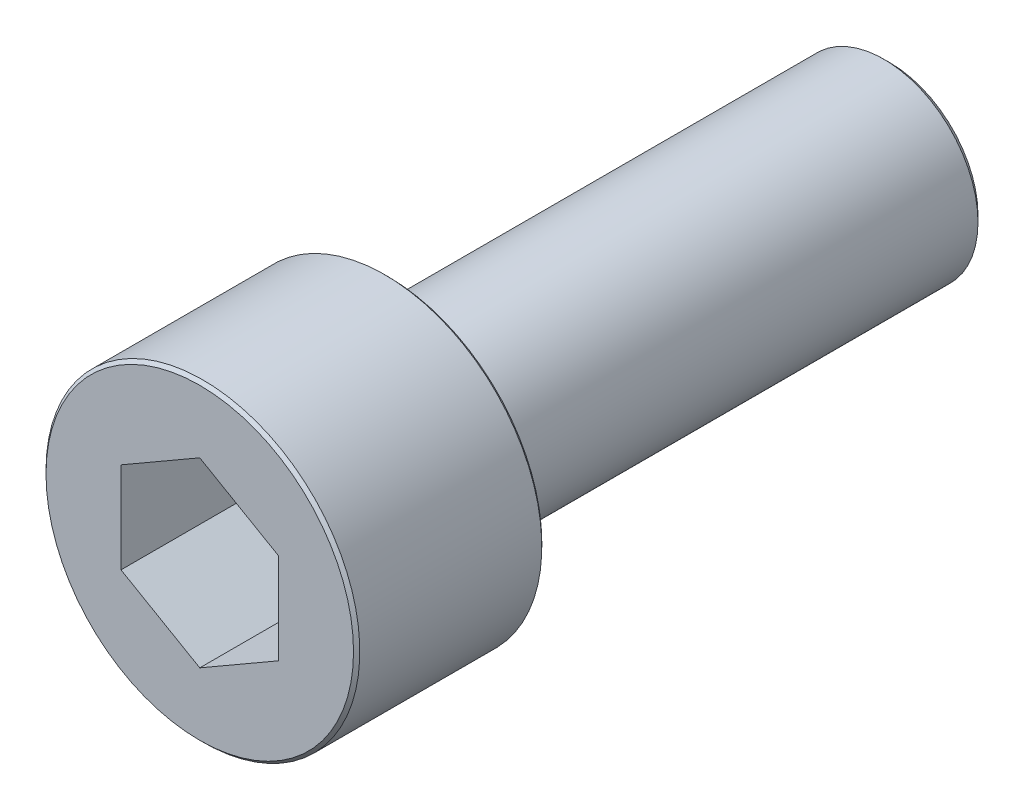
ISO-10303-21;
HEADER;
FILE_DESCRIPTION(('STEP AP214'),'2;1');
FILE_NAME('part.step','',(''),(''),'','','');
FILE_SCHEMA(('AUTOMOTIVE_DESIGN { 1 0 10303 214 1 1 1 1 }'));
ENDSEC;
DATA;
#1=APPLICATION_CONTEXT('core data for automotive mechanical design processes');
#2=APPLICATION_PROTOCOL_DEFINITION('international standard','automotive_design',2000,#1);
#3=PRODUCT_CONTEXT('',#1,'mechanical');
#4=PRODUCT('Part','Part','',(#3));
#5=PRODUCT_RELATED_PRODUCT_CATEGORY('part','',(#4));
#6=PRODUCT_DEFINITION_FORMATION('','',#4);
#7=PRODUCT_DEFINITION_CONTEXT('part definition',#1,'design');
#8=PRODUCT_DEFINITION('design','',#6,#7);
#9=PRODUCT_DEFINITION_SHAPE('','',#8);
#10=(LENGTH_UNIT() NAMED_UNIT(*) SI_UNIT(.MILLI.,.METRE.));
#11=(NAMED_UNIT(*) PLANE_ANGLE_UNIT() SI_UNIT($,.RADIAN.));
#12=(NAMED_UNIT(*) SI_UNIT($,.STERADIAN.) SOLID_ANGLE_UNIT());
#13=UNCERTAINTY_MEASURE_WITH_UNIT(LENGTH_MEASURE(1.E-05),#10,'distance_accuracy_value','');
#14=(GEOMETRIC_REPRESENTATION_CONTEXT(3) GLOBAL_UNCERTAINTY_ASSIGNED_CONTEXT((#13)) GLOBAL_UNIT_ASSIGNED_CONTEXT((#10,
#11,#12)) REPRESENTATION_CONTEXT('',''));
#15=CARTESIAN_POINT('',(0.,0.,0.));
#16=DIRECTION('',(0.,0.,1.));
#17=DIRECTION('',(1.,0.,0.));
#18=AXIS2_PLACEMENT_3D('',#15,#16,#17);
#19=CARTESIAN_POINT('',(0.,0.,16.));
#20=DIRECTION('',(0.,0.,1.));
#21=DIRECTION('',(1.,0.,0.));
#22=AXIS2_PLACEMENT_3D('',#19,#20,#21);
#23=CYLINDRICAL_SURFACE('',#22,5.);
#24=CARTESIAN_POINT('',(0.,0.,16.0999996677392));
#25=DIRECTION('',(0.,0.,-1.));
#26=DIRECTION('',(-1.,0.,0.));
#27=AXIS2_PLACEMENT_3D('',#24,#25,#26);
#28=CIRCLE('',#27,5.);
#29=CARTESIAN_POINT('',(-5.,0.,16.0999996677392));
#30=VERTEX_POINT('',#29);
#31=EDGE_CURVE('E155',#30,#30,#28,.F.);
#32=ORIENTED_EDGE('',*,*,#31,.T.);
#33=EDGE_LOOP('',(#32));
#34=FACE_BOUND('',#33,.T.);
#35=CARTESIAN_POINT('',(0.,0.,21.9000003750631));
#36=DIRECTION('',(0.,0.,1.));
#37=DIRECTION('',(1.,0.,0.));
#38=AXIS2_PLACEMENT_3D('',#35,#36,#37);
#39=CIRCLE('',#38,5.);
#40=CARTESIAN_POINT('',(-5.,0.,21.9000003750631));
#41=VERTEX_POINT('',#40);
#42=EDGE_CURVE('E152',#41,#41,#39,.F.);
#43=ORIENTED_EDGE('',*,*,#42,.T.);
#44=EDGE_LOOP('',(#43));
#45=FACE_BOUND('',#44,.T.);
#46=ADVANCED_FACE('F41',(#34,#45),#23,.T.);
#47=CARTESIAN_POINT('',(5.,0.,16.));
#48=DIRECTION('',(0.,0.,-1.));
#49=DIRECTION('',(-1.,0.,0.));
#50=AXIS2_PLACEMENT_3D('',#47,#48,#49);
#51=PLANE('',#50);
#52=CARTESIAN_POINT('',(0.,0.,16.));
#53=DIRECTION('',(0.,0.,-1.));
#54=DIRECTION('',(-1.,0.,0.));
#55=AXIS2_PLACEMENT_3D('',#52,#53,#54);
#56=CIRCLE('',#55,4.90000037506315);
#57=CARTESIAN_POINT('',(-4.90000037506315,0.,16.));
#58=VERTEX_POINT('',#57);
#59=EDGE_CURVE('E158',#58,#58,#56,.T.);
#60=ORIENTED_EDGE('',*,*,#59,.T.);
#61=EDGE_LOOP('',(#60));
#62=FACE_BOUND('',#61,.T.);
#63=CARTESIAN_POINT('',(0.,0.,16.));
#64=DIRECTION('',(0.,0.,-1.));
#65=DIRECTION('',(-1.,0.,0.));
#66=AXIS2_PLACEMENT_3D('',#63,#64,#65);
#67=CIRCLE('',#66,3.);
#68=CARTESIAN_POINT('',(-3.,0.,16.));
#69=VERTEX_POINT('',#68);
#70=EDGE_CURVE('E144',#69,#69,#67,.T.);
#71=ORIENTED_EDGE('',*,*,#70,.F.);
#72=EDGE_LOOP('',(#71));
#73=FACE_BOUND('',#72,.T.);
#74=ADVANCED_FACE('F178',(#62,#73),#51,.T.);
#75=CARTESIAN_POINT('',(0.,0.,22.));
#76=DIRECTION('',(0.,0.,1.));
#77=DIRECTION('',(1.,0.,0.));
#78=AXIS2_PLACEMENT_3D('',#75,#76,#77);
#79=PLANE('',#78);
#80=CARTESIAN_POINT('',(0.,0.,22.));
#81=DIRECTION('',(0.,0.,1.));
#82=DIRECTION('',(1.,0.,0.));
#83=AXIS2_PLACEMENT_3D('',#80,#81,#82);
#84=CIRCLE('',#83,4.90000033226079);
#85=CARTESIAN_POINT('',(-4.90000033226079,0.,22.));
#86=VERTEX_POINT('',#85);
#87=EDGE_CURVE('E161',#86,#86,#84,.T.);
#88=ORIENTED_EDGE('',*,*,#87,.T.);
#89=EDGE_LOOP('',(#88));
#90=FACE_BOUND('',#89,.T.);
#91=DIRECTION('',(0.,-1.,0.));
#92=VECTOR('',#91,1.);
#93=CARTESIAN_POINT('',(-2.51,1.449149175666,22.));
#94=LINE('',#93,#92);
#95=CARTESIAN_POINT('',(-2.51,1.449149175666,22.));
#96=VERTEX_POINT('',#95);
#97=CARTESIAN_POINT('',(-2.51,-1.449149175666,22.));
#98=VERTEX_POINT('',#97);
#99=EDGE_CURVE('E57',#96,#98,#94,.T.);
#100=ORIENTED_EDGE('',*,*,#99,.F.);
#101=DIRECTION('',(-0.866025403784431,-0.500000000000014,0.));
#102=VECTOR('',#101,1.);
#103=CARTESIAN_POINT('',(0.,2.89829835133201,22.));
#104=LINE('',#103,#102);
#105=CARTESIAN_POINT('',(0.,2.89829835133201,22.));
#106=VERTEX_POINT('',#105);
#107=EDGE_CURVE('E140',#106,#96,#104,.T.);
#108=ORIENTED_EDGE('',*,*,#107,.F.);
#109=DIRECTION('',(-0.866025403784431,0.500000000000014,0.));
#110=VECTOR('',#109,1.);
#111=CARTESIAN_POINT('',(2.51,1.449149175666,22.));
#112=LINE('',#111,#110);
#113=CARTESIAN_POINT('',(2.51,1.449149175666,22.));
#114=VERTEX_POINT('',#113);
#115=EDGE_CURVE('E138',#114,#106,#112,.T.);
#116=ORIENTED_EDGE('',*,*,#115,.F.);
#117=DIRECTION('',(0.,1.,0.));
#118=VECTOR('',#117,1.);
#119=CARTESIAN_POINT('',(2.51,-1.449149175666,22.));
#120=LINE('',#119,#118);
#121=CARTESIAN_POINT('',(2.51,-1.449149175666,22.));
#122=VERTEX_POINT('',#121);
#123=EDGE_CURVE('E105',#122,#114,#120,.T.);
#124=ORIENTED_EDGE('',*,*,#123,.F.);
#125=DIRECTION('',(0.866025403784431,0.500000000000013,0.));
#126=VECTOR('',#125,1.);
#127=CARTESIAN_POINT('',(0.,-2.898298351332,22.));
#128=LINE('',#127,#126);
#129=CARTESIAN_POINT('',(0.,-2.898298351332,22.));
#130=VERTEX_POINT('',#129);
#131=EDGE_CURVE('E134',#130,#122,#128,.T.);
#132=ORIENTED_EDGE('',*,*,#131,.F.);
#133=DIRECTION('',(0.866025403784432,-0.500000000000012,0.));
#134=VECTOR('',#133,1.);
#135=CARTESIAN_POINT('',(-2.51,-1.449149175666,22.));
#136=LINE('',#135,#134);
#137=EDGE_CURVE('E131',#98,#130,#136,.T.);
#138=ORIENTED_EDGE('',*,*,#137,.F.);
#139=EDGE_LOOP('',(#100,#108,#116,#124,#132,#138));
#140=FACE_BOUND('',#139,.T.);
#141=ADVANCED_FACE('F184',(#90,#140),#79,.T.);
#142=CARTESIAN_POINT('',(0.,0.,0.));
#143=DIRECTION('',(0.,0.,1.));
#144=DIRECTION('',(1.,0.,0.));
#145=AXIS2_PLACEMENT_3D('',#142,#143,#144);
#146=CYLINDRICAL_SURFACE('',#145,3.);
#147=CARTESIAN_POINT('',(0.,0.,0.200009615210983));
#148=DIRECTION('',(0.,0.,-1.));
#149=DIRECTION('',(-1.,0.,0.));
#150=AXIS2_PLACEMENT_3D('',#147,#148,#149);
#151=CIRCLE('',#150,3.);
#152=CARTESIAN_POINT('',(-3.,0.,0.200009615210983));
#153=VERTEX_POINT('',#152);
#154=EDGE_CURVE('E11',#153,#153,#151,.F.);
#155=ORIENTED_EDGE('',*,*,#154,.T.);
#156=EDGE_LOOP('',(#155));
#157=FACE_BOUND('',#156,.T.);
#158=ORIENTED_EDGE('',*,*,#70,.T.);
#159=EDGE_LOOP('',(#158));
#160=FACE_BOUND('',#159,.T.);
#161=ADVANCED_FACE('F211',(#157,#160),#146,.T.);
#162=CARTESIAN_POINT('',(0.,0.,0.));
#163=DIRECTION('',(0.,0.,-1.));
#164=DIRECTION('',(-1.,0.,0.));
#165=AXIS2_PLACEMENT_3D('',#162,#163,#164);
#166=PLANE('',#165);
#167=CARTESIAN_POINT('',(0.,0.,0.));
#168=DIRECTION('',(0.,0.,-1.));
#169=DIRECTION('',(-1.,0.,0.));
#170=AXIS2_PLACEMENT_3D('',#167,#168,#169);
#171=CIRCLE('',#170,2.79999102583599);
#172=CARTESIAN_POINT('',(-2.79999102583599,0.,0.));
#173=VERTEX_POINT('',#172);
#174=EDGE_CURVE('E50',#173,#173,#171,.T.);
#175=ORIENTED_EDGE('',*,*,#174,.T.);
#176=EDGE_LOOP('',(#175));
#177=FACE_BOUND('',#176,.T.);
#178=ADVANCED_FACE('F166',(#177),#166,.T.);
#179=CARTESIAN_POINT('',(-2.51,1.449149175666,17.5));
#180=DIRECTION('',(-1.,0.,0.));
#181=DIRECTION('',(0.,-1.,0.));
#182=AXIS2_PLACEMENT_3D('',#179,#180,#181);
#183=PLANE('',#182);
#184=ORIENTED_EDGE('',*,*,#99,.T.);
#185=DIRECTION('',(0.,0.,1.));
#186=VECTOR('',#185,1.);
#187=CARTESIAN_POINT('',(-2.51,-1.449149175666,17.5));
#188=LINE('',#187,#186);
#189=CARTESIAN_POINT('',(-2.51,-1.449149175666,17.5));
#190=VERTEX_POINT('',#189);
#191=EDGE_CURVE('E87',#190,#98,#188,.T.);
#192=ORIENTED_EDGE('',*,*,#191,.F.);
#193=DIRECTION('',(0.,-1.,0.));
#194=VECTOR('',#193,1.);
#195=CARTESIAN_POINT('',(-2.51,1.449149175666,17.5));
#196=LINE('',#195,#194);
#197=CARTESIAN_POINT('',(-2.51,1.449149175666,17.5));
#198=VERTEX_POINT('',#197);
#199=EDGE_CURVE('E142',#198,#190,#196,.T.);
#200=ORIENTED_EDGE('',*,*,#199,.F.);
#201=DIRECTION('',(0.,0.,1.));
#202=VECTOR('',#201,1.);
#203=CARTESIAN_POINT('',(-2.51,1.449149175666,17.5));
#204=LINE('',#203,#202);
#205=EDGE_CURVE('E65',#198,#96,#204,.T.);
#206=ORIENTED_EDGE('',*,*,#205,.T.);
#207=EDGE_LOOP('',(#184,#192,#200,#206));
#208=FACE_BOUND('',#207,.T.);
#209=ADVANCED_FACE('F219',(#208),#183,.F.);
#210=CARTESIAN_POINT('',(0.,2.89829835133201,17.5));
#211=DIRECTION('',(-0.500000000000014,0.866025403784431,0.));
#212=DIRECTION('',(-0.866025403784431,-0.500000000000014,0.));
#213=AXIS2_PLACEMENT_3D('',#210,#211,#212);
#214=PLANE('',#213);
#215=ORIENTED_EDGE('',*,*,#107,.T.);
#216=ORIENTED_EDGE('',*,*,#205,.F.);
#217=DIRECTION('',(-0.866025403784431,-0.500000000000014,0.));
#218=VECTOR('',#217,1.);
#219=CARTESIAN_POINT('',(0.,2.89829835133201,17.5));
#220=LINE('',#219,#218);
#221=CARTESIAN_POINT('',(0.,2.89829835133201,17.5));
#222=VERTEX_POINT('',#221);
#223=EDGE_CURVE('E117',#222,#198,#220,.T.);
#224=ORIENTED_EDGE('',*,*,#223,.F.);
#225=DIRECTION('',(0.,0.,1.));
#226=VECTOR('',#225,1.);
#227=CARTESIAN_POINT('',(0.,2.89829835133201,17.5));
#228=LINE('',#227,#226);
#229=EDGE_CURVE('E109',#222,#106,#228,.T.);
#230=ORIENTED_EDGE('',*,*,#229,.T.);
#231=EDGE_LOOP('',(#215,#216,#224,#230));
#232=FACE_BOUND('',#231,.T.);
#233=ADVANCED_FACE('F225',(#232),#214,.F.);
#234=CARTESIAN_POINT('',(2.51,1.449149175666,17.5));
#235=DIRECTION('',(0.500000000000014,0.866025403784431,0.));
#236=DIRECTION('',(-0.866025403784431,0.500000000000014,0.));
#237=AXIS2_PLACEMENT_3D('',#234,#235,#236);
#238=PLANE('',#237);
#239=ORIENTED_EDGE('',*,*,#115,.T.);
#240=ORIENTED_EDGE('',*,*,#229,.F.);
#241=DIRECTION('',(-0.866025403784431,0.500000000000014,0.));
#242=VECTOR('',#241,1.);
#243=CARTESIAN_POINT('',(2.51,1.449149175666,17.5));
#244=LINE('',#243,#242);
#245=CARTESIAN_POINT('',(2.51,1.449149175666,17.5));
#246=VERTEX_POINT('',#245);
#247=EDGE_CURVE('E113',#246,#222,#244,.T.);
#248=ORIENTED_EDGE('',*,*,#247,.F.);
#249=DIRECTION('',(0.,0.,1.));
#250=VECTOR('',#249,1.);
#251=CARTESIAN_POINT('',(2.51,1.449149175666,17.5));
#252=LINE('',#251,#250);
#253=EDGE_CURVE('E98',#246,#114,#252,.T.);
#254=ORIENTED_EDGE('',*,*,#253,.T.);
#255=EDGE_LOOP('',(#239,#240,#248,#254));
#256=FACE_BOUND('',#255,.T.);
#257=ADVANCED_FACE('F114',(#256),#238,.F.);
#258=CARTESIAN_POINT('',(2.51,-1.449149175666,17.5));
#259=DIRECTION('',(1.,0.,0.));
#260=DIRECTION('',(0.,1.,0.));
#261=AXIS2_PLACEMENT_3D('',#258,#259,#260);
#262=PLANE('',#261);
#263=ORIENTED_EDGE('',*,*,#123,.T.);
#264=ORIENTED_EDGE('',*,*,#253,.F.);
#265=DIRECTION('',(0.,1.,0.));
#266=VECTOR('',#265,1.);
#267=CARTESIAN_POINT('',(2.51,-1.449149175666,17.5));
#268=LINE('',#267,#266);
#269=CARTESIAN_POINT('',(2.51,-1.449149175666,17.5));
#270=VERTEX_POINT('',#269);
#271=EDGE_CURVE('E102',#270,#246,#268,.T.);
#272=ORIENTED_EDGE('',*,*,#271,.F.);
#273=DIRECTION('',(0.,0.,1.));
#274=VECTOR('',#273,1.);
#275=CARTESIAN_POINT('',(2.51,-1.449149175666,17.5));
#276=LINE('',#275,#274);
#277=EDGE_CURVE('E110',#270,#122,#276,.T.);
#278=ORIENTED_EDGE('',*,*,#277,.T.);
#279=EDGE_LOOP('',(#263,#264,#272,#278));
#280=FACE_BOUND('',#279,.T.);
#281=ADVANCED_FACE('F100',(#280),#262,.F.);
#282=CARTESIAN_POINT('',(0.,-2.898298351332,17.5));
#283=DIRECTION('',(0.500000000000013,-0.866025403784431,0.));
#284=DIRECTION('',(0.866025403784431,0.500000000000013,0.));
#285=AXIS2_PLACEMENT_3D('',#282,#283,#284);
#286=PLANE('',#285);
#287=ORIENTED_EDGE('',*,*,#131,.T.);
#288=ORIENTED_EDGE('',*,*,#277,.F.);
#289=DIRECTION('',(0.866025403784431,0.500000000000013,0.));
#290=VECTOR('',#289,1.);
#291=CARTESIAN_POINT('',(0.,-2.898298351332,17.5));
#292=LINE('',#291,#290);
#293=CARTESIAN_POINT('',(0.,-2.898298351332,17.5));
#294=VERTEX_POINT('',#293);
#295=EDGE_CURVE('E123',#294,#270,#292,.T.);
#296=ORIENTED_EDGE('',*,*,#295,.F.);
#297=DIRECTION('',(0.,0.,1.));
#298=VECTOR('',#297,1.);
#299=CARTESIAN_POINT('',(0.,-2.898298351332,17.5));
#300=LINE('',#299,#298);
#301=EDGE_CURVE('E147',#294,#130,#300,.T.);
#302=ORIENTED_EDGE('',*,*,#301,.T.);
#303=EDGE_LOOP('',(#287,#288,#296,#302));
#304=FACE_BOUND('',#303,.T.);
#305=ADVANCED_FACE('F228',(#304),#286,.F.);
#306=CARTESIAN_POINT('',(-2.51,-1.449149175666,17.5));
#307=DIRECTION('',(-0.500000000000012,-0.866025403784432,0.));
#308=DIRECTION('',(0.866025403784432,-0.500000000000012,0.));
#309=AXIS2_PLACEMENT_3D('',#306,#307,#308);
#310=PLANE('',#309);
#311=ORIENTED_EDGE('',*,*,#137,.T.);
#312=ORIENTED_EDGE('',*,*,#301,.F.);
#313=DIRECTION('',(0.866025403784432,-0.500000000000012,0.));
#314=VECTOR('',#313,1.);
#315=CARTESIAN_POINT('',(-2.51,-1.449149175666,17.5));
#316=LINE('',#315,#314);
#317=EDGE_CURVE('E125',#190,#294,#316,.T.);
#318=ORIENTED_EDGE('',*,*,#317,.F.);
#319=ORIENTED_EDGE('',*,*,#191,.T.);
#320=EDGE_LOOP('',(#311,#312,#318,#319));
#321=FACE_BOUND('',#320,.T.);
#322=ADVANCED_FACE('F203',(#321),#310,.F.);
#323=CARTESIAN_POINT('',(0.,0.,17.5));
#324=DIRECTION('',(0.,0.,1.));
#325=DIRECTION('',(1.,0.,0.));
#326=AXIS2_PLACEMENT_3D('',#323,#324,#325);
#327=PLANE('',#326);
#328=ORIENTED_EDGE('',*,*,#199,.T.);
#329=ORIENTED_EDGE('',*,*,#317,.T.);
#330=ORIENTED_EDGE('',*,*,#295,.T.);
#331=ORIENTED_EDGE('',*,*,#271,.T.);
#332=ORIENTED_EDGE('',*,*,#247,.T.);
#333=ORIENTED_EDGE('',*,*,#223,.T.);
#334=EDGE_LOOP('',(#328,#329,#330,#331,#332,#333));
#335=FACE_BOUND('',#334,.T.);
#336=ADVANCED_FACE('F120',(#335),#327,.T.);
#337=CARTESIAN_POINT('',(0.,0.,16.0999996677392));
#338=DIRECTION('',(0.,0.,1.));
#339=DIRECTION('',(1.,0.,0.));
#340=AXIS2_PLACEMENT_3D('',#337,#338,#339);
#341=CONICAL_SURFACE('',#340,5.,0.78539794938491);
#342=ORIENTED_EDGE('',*,*,#59,.F.);
#343=EDGE_LOOP('',(#342));
#344=FACE_BOUND('',#343,.T.);
#345=ORIENTED_EDGE('',*,*,#31,.F.);
#346=EDGE_LOOP('',(#345));
#347=FACE_BOUND('',#346,.T.);
#348=ADVANCED_FACE('F174',(#344,#347),#341,.T.);
#349=CARTESIAN_POINT('',(0.,0.,22.));
#350=DIRECTION('',(0.,0.,-1.));
#351=DIRECTION('',(-1.,0.,0.));
#352=AXIS2_PLACEMENT_3D('',#349,#350,#351);
#353=CONICAL_SURFACE('',#352,4.90000033226079,0.785398377409995);
#354=CARTESIAN_POINT('',(-5.,0.,21.9000003750631));
#355=CARTESIAN_POINT('',(-4.99895833679438,0.,21.9010420378229));
#356=CARTESIAN_POINT('',(-4.99791667358877,0.,21.9020837005827));
#357=CARTESIAN_POINT('',(-4.99583334717753,0.,21.9041670261022));
#358=CARTESIAN_POINT('',(-4.99479168397192,0.,21.9052086888619));
#359=CARTESIAN_POINT('',(-4.99270835756068,0.,21.9072920143815));
#360=CARTESIAN_POINT('',(-4.99166669435507,0.,21.9083336771412));
#361=CARTESIAN_POINT('',(-4.98958336794383,0.,21.9104170026607));
#362=CARTESIAN_POINT('',(-4.98854170473822,0.,21.9114586654205));
#363=CARTESIAN_POINT('',(-4.98645837832698,0.,21.91354199094));
#364=CARTESIAN_POINT('',(-4.98541671512137,0.,21.9145836536998));
#365=CARTESIAN_POINT('',(-4.98333338871013,0.,21.9166669792193));
#366=CARTESIAN_POINT('',(-4.98229172550452,0.,21.917708641979));
#367=CARTESIAN_POINT('',(-4.98020839909328,0.,21.9197919674986));
#368=CARTESIAN_POINT('',(-4.97916673588767,0.,21.9208336302583));
#369=CARTESIAN_POINT('',(-4.97708340947643,0.,21.9229169557778));
#370=CARTESIAN_POINT('',(-4.97604174627081,0.,21.9239586185376));
#371=CARTESIAN_POINT('',(-4.97395841985958,0.,21.9260419440571));
#372=CARTESIAN_POINT('',(-4.97291675665396,0.,21.9270836068169));
#373=CARTESIAN_POINT('',(-4.97083343024273,0.,21.9291669323364));
#374=CARTESIAN_POINT('',(-4.96979176703711,0.,21.9302085950962));
#375=CARTESIAN_POINT('',(-4.96770844062588,0.,21.9322919206157));
#376=CARTESIAN_POINT('',(-4.96666677742026,0.,21.9333335833754));
#377=CARTESIAN_POINT('',(-4.96458345100903,0.,21.9354169088949));
#378=CARTESIAN_POINT('',(-4.96354178780341,0.,21.9364585716547));
#379=CARTESIAN_POINT('',(-4.96145846139218,0.,21.9385418971742));
#380=CARTESIAN_POINT('',(-4.96041679818656,0.,21.939583559934));
#381=CARTESIAN_POINT('',(-4.95833347177533,0.,21.9416668854535));
#382=CARTESIAN_POINT('',(-4.95729180856971,0.,21.9427085482133));
#383=CARTESIAN_POINT('',(-4.95520848215848,0.,21.9447918737328));
#384=CARTESIAN_POINT('',(-4.95416681895286,0.,21.9458335364925));
#385=CARTESIAN_POINT('',(-4.95208349254163,0.,21.9479168620121));
#386=CARTESIAN_POINT('',(-4.95104182933601,0.,21.9489585247718));
#387=CARTESIAN_POINT('',(-4.94895850292478,0.,21.9510418502913));
#388=CARTESIAN_POINT('',(-4.94791683971916,0.,21.9520835130511));
#389=CARTESIAN_POINT('',(-4.94583351330793,0.,21.9541668385706));
#390=CARTESIAN_POINT('',(-4.94479185010231,0.,21.9552085013304));
#391=CARTESIAN_POINT('',(-4.94270852369108,0.,21.9572918268499));
#392=CARTESIAN_POINT('',(-4.94166686048546,0.,21.9583334896096));
#393=CARTESIAN_POINT('',(-4.93958353407423,0.,21.9604168151292));
#394=CARTESIAN_POINT('',(-4.93854187086861,0.,21.9614584778889));
#395=CARTESIAN_POINT('',(-4.93645854445738,0.,21.9635418034084));
#396=CARTESIAN_POINT('',(-4.93541688125176,0.,21.9645834661682));
#397=CARTESIAN_POINT('',(-4.93333355484053,0.,21.9666667916877));
#398=CARTESIAN_POINT('',(-4.93229189163491,0.,21.9677084544475));
#399=CARTESIAN_POINT('',(-4.93020856522368,0.,21.969791779967));
#400=CARTESIAN_POINT('',(-4.92916690201806,0.,21.9708334427267));
#401=CARTESIAN_POINT('',(-4.92708357560683,0.,21.9729167682463));
#402=CARTESIAN_POINT('',(-4.92604191240121,0.,21.973958431006));
#403=CARTESIAN_POINT('',(-4.92395858598998,0.,21.9760417565255));
#404=CARTESIAN_POINT('',(-4.92291692278436,0.,21.9770834192853));
#405=CARTESIAN_POINT('',(-4.92083359637312,0.,21.9791667448048));
#406=CARTESIAN_POINT('',(-4.91979193316751,0.,21.9802084075646));
#407=CARTESIAN_POINT('',(-4.91770860675627,0.,21.9822917330841));
#408=CARTESIAN_POINT('',(-4.91666694355066,0.,21.9833333958439));
#409=CARTESIAN_POINT('',(-4.91458361713942,0.,21.9854167213634));
#410=CARTESIAN_POINT('',(-4.91354195393381,0.,21.9864583841231));
#411=CARTESIAN_POINT('',(-4.91145862752257,0.,21.9885417096427));
#412=CARTESIAN_POINT('',(-4.91041696431696,0.,21.9895833724024));
#413=CARTESIAN_POINT('',(-4.90833363790572,0.,21.9916666979219));
#414=CARTESIAN_POINT('',(-4.90729197470011,0.,21.9927083606817));
#415=CARTESIAN_POINT('',(-4.90520864828887,0.,21.9947916862012));
#416=CARTESIAN_POINT('',(-4.90416698508325,0.,21.995833348961));
#417=CARTESIAN_POINT('',(-4.90208365867202,0.,21.9979166744805));
#418=CARTESIAN_POINT('',(-4.90104199546641,0.,21.9989583372402));
#419=CARTESIAN_POINT('',(-4.90000033226079,0.,22.));
#420=B_SPLINE_CURVE_WITH_KNOTS('',3,(#354,#355,#356,#357,#358,#359,#360,#361,#362,#363,#364,
#365,#366,#367,#368,#369,#370,#371,#372,#373,#374,#375,#376,#377,#378,#379,#380,#381,#382,#383,
#384,#385,#386,#387,#388,#389,#390,#391,#392,#393,#394,#395,#396,#397,#398,#399,#400,#401,#402,
#403,#404,#405,#406,#407,#408,#409,#410,#411,#412,#413,#414,#415,#416,#417,#418,#419),
.UNSPECIFIED.,.F.,.F.,(4,2,2,2,2,2,2,2,2,2,2,2,2,2,2,2,2,2,2,2,2,2,2,2,2,2,2,2,2,2,2,2,4),(0.,
0.00441940175261859,0.00883880350523718,0.0132582052578533,0.0176776070104719,
0.0220970087630905,0.0265164105157066,0.0309358122683252,0.0353552140209414,0.03977461577356,
0.0441940175261786,0.0486134192787947,0.0530328210314133,0.0574522227840319,0.061871624536648,
0.0662910262892666,0.0707104280418821,0.0751298297945007,0.0795492315471193,0.0839686332997354,
0.088388035052354,0.0928074368049726,0.0972268385575887,0.101646240310207,0.106065642062826,
0.110485043815442,0.114904445568061,0.119323847320677,0.123743249073295,0.128162650825914,
0.13258205257853,0.137001454331149,0.141420856083767),.UNSPECIFIED.);
#421=EDGE_CURVE('BSEAM169',#41,#86,#420,.T.);
#422=ORIENTED_EDGE('',*,*,#42,.F.);
#423=ORIENTED_EDGE('',*,*,#87,.F.);
#424=ORIENTED_EDGE('',*,*,#421,.T.);
#425=ORIENTED_EDGE('',*,*,#421,.F.);
#426=EDGE_LOOP('',(#422,#424,#423,#425));
#427=FACE_BOUND('',#426,.T.);
#428=ADVANCED_FACE('F169',(#427),#353,.T.);
#429=CARTESIAN_POINT('',(0.,0.,0.));
#430=DIRECTION('',(0.,0.,1.));
#431=DIRECTION('',(1.,0.,0.));
#432=AXIS2_PLACEMENT_3D('',#429,#430,#431);
#433=CONICAL_SURFACE('',#432,2.79999102583599,0.785396560854488);
#434=ORIENTED_EDGE('',*,*,#154,.F.);
#435=EDGE_LOOP('',(#434));
#436=FACE_BOUND('',#435,.T.);
#437=ORIENTED_EDGE('',*,*,#174,.F.);
#438=EDGE_LOOP('',(#437));
#439=FACE_BOUND('',#438,.T.);
#440=ADVANCED_FACE('F44',(#436,#439),#433,.T.);
#441=CLOSED_SHELL('',(#46,#74,#141,#161,#178,#209,#233,#257,#281,#305,#322,#336,#348,#428,#440));
#442=MANIFOLD_SOLID_BREP('B2',#441);
#443=ADVANCED_BREP_SHAPE_REPRESENTATION('',(#18,#442),#14);
#444=SHAPE_DEFINITION_REPRESENTATION(#9,#443);
ENDSEC;
END-ISO-10303-21;
